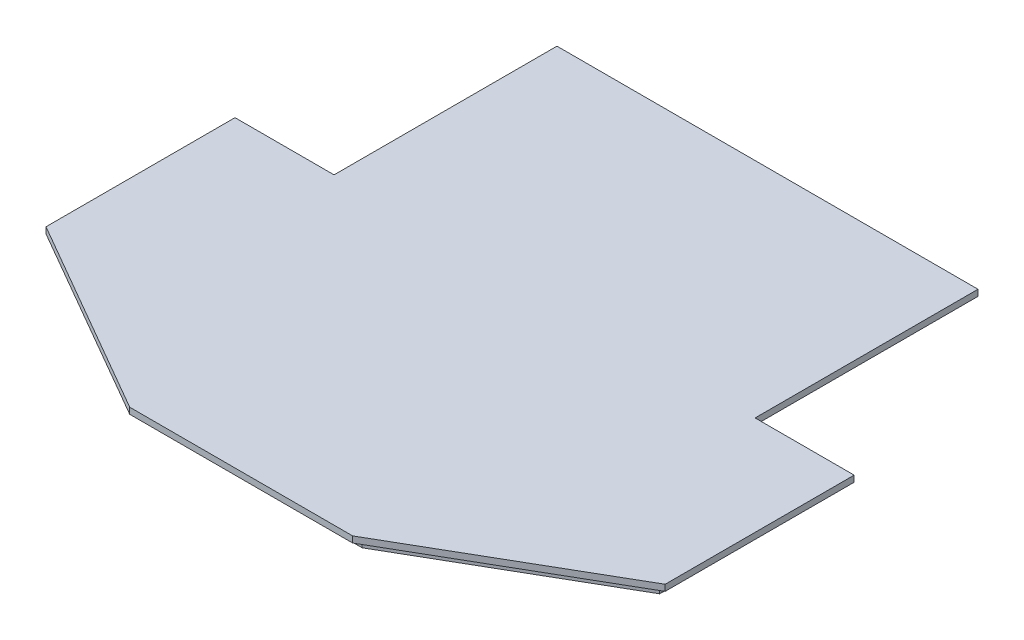
ISO-10303-21;
HEADER;
FILE_DESCRIPTION(('STEP AP214'),'2;1');
FILE_NAME('part.step','',(''),(''),'','','');
FILE_SCHEMA(('AUTOMOTIVE_DESIGN { 1 0 10303 214 1 1 1 1 }'));
ENDSEC;
DATA;
#1=APPLICATION_CONTEXT('core data for automotive mechanical design processes');
#2=APPLICATION_PROTOCOL_DEFINITION('international standard','automotive_design',2000,#1);
#3=PRODUCT_CONTEXT('',#1,'mechanical');
#4=PRODUCT('Part','Part','',(#3));
#5=PRODUCT_RELATED_PRODUCT_CATEGORY('part','',(#4));
#6=PRODUCT_DEFINITION_FORMATION('','',#4);
#7=PRODUCT_DEFINITION_CONTEXT('part definition',#1,'design');
#8=PRODUCT_DEFINITION('design','',#6,#7);
#9=PRODUCT_DEFINITION_SHAPE('','',#8);
#10=(LENGTH_UNIT() NAMED_UNIT(*) SI_UNIT(.MILLI.,.METRE.));
#11=(NAMED_UNIT(*) PLANE_ANGLE_UNIT() SI_UNIT($,.RADIAN.));
#12=(NAMED_UNIT(*) SI_UNIT($,.STERADIAN.) SOLID_ANGLE_UNIT());
#13=UNCERTAINTY_MEASURE_WITH_UNIT(LENGTH_MEASURE(1.E-05),#10,'distance_accuracy_value','');
#14=(GEOMETRIC_REPRESENTATION_CONTEXT(3) GLOBAL_UNCERTAINTY_ASSIGNED_CONTEXT((#13)) GLOBAL_UNIT_ASSIGNED_CONTEXT((#10,
#11,#12)) REPRESENTATION_CONTEXT('',''));
#15=CARTESIAN_POINT('',(0.,0.,0.));
#16=DIRECTION('',(0.,0.,1.));
#17=DIRECTION('',(1.,0.,0.));
#18=AXIS2_PLACEMENT_3D('',#15,#16,#17);
#19=CARTESIAN_POINT('',(-99.9999999999999,2.,72.));
#20=DIRECTION('',(0.,0.,1.));
#21=DIRECTION('',(1.,0.,0.));
#22=AXIS2_PLACEMENT_3D('',#19,#20,#21);
#23=PLANE('',#22);
#24=DIRECTION('',(-1.,0.,0.));
#25=VECTOR('',#24,1.);
#26=CARTESIAN_POINT('',(-99.9999999999999,0.,72.));
#27=LINE('',#26,#25);
#28=CARTESIAN_POINT('',(-68.,0.,72.));
#29=VERTEX_POINT('',#28);
#30=CARTESIAN_POINT('',(-99.9999999999999,0.,72.));
#31=VERTEX_POINT('',#30);
#32=EDGE_CURVE('E375',#29,#31,#27,.T.);
#33=ORIENTED_EDGE('',*,*,#32,.T.);
#34=DIRECTION('',(0.,-1.,0.));
#35=VECTOR('',#34,1.);
#36=CARTESIAN_POINT('',(-99.9999999999999,2.,72.));
#37=LINE('',#36,#35);
#38=CARTESIAN_POINT('',(-99.9999999999999,2.,72.));
#39=VERTEX_POINT('',#38);
#40=EDGE_CURVE('E11',#39,#31,#37,.T.);
#41=ORIENTED_EDGE('',*,*,#40,.F.);
#42=DIRECTION('',(-1.,0.,0.));
#43=VECTOR('',#42,1.);
#44=CARTESIAN_POINT('',(-99.9999999999999,2.,72.));
#45=LINE('',#44,#43);
#46=CARTESIAN_POINT('',(-68.,2.,72.));
#47=VERTEX_POINT('',#46);
#48=EDGE_CURVE('E393',#47,#39,#45,.T.);
#49=ORIENTED_EDGE('',*,*,#48,.F.);
#50=DIRECTION('',(0.,-1.,0.));
#51=VECTOR('',#50,1.);
#52=CARTESIAN_POINT('',(-68.,2.,72.));
#53=LINE('',#52,#51);
#54=EDGE_CURVE('E415',#47,#29,#53,.T.);
#55=ORIENTED_EDGE('',*,*,#54,.T.);
#56=EDGE_LOOP('',(#33,#41,#49,#55));
#57=FACE_BOUND('',#56,.T.);
#58=ADVANCED_FACE('F43',(#57),#23,.F.);
#59=CARTESIAN_POINT('',(-99.9999999999999,2.,72.));
#60=DIRECTION('',(1.,0.,0.));
#61=DIRECTION('',(0.,0.,-1.));
#62=AXIS2_PLACEMENT_3D('',#59,#60,#61);
#63=PLANE('',#62);
#64=DIRECTION('',(0.,0.,1.));
#65=VECTOR('',#64,1.);
#66=CARTESIAN_POINT('',(-99.9999999999999,0.,72.));
#67=LINE('',#66,#65);
#68=CARTESIAN_POINT('',(-99.9999999999999,0.,133.049582771864));
#69=VERTEX_POINT('',#68);
#70=EDGE_CURVE('E418',#31,#69,#67,.T.);
#71=ORIENTED_EDGE('',*,*,#70,.T.);
#72=DIRECTION('',(0.,-1.,0.));
#73=VECTOR('',#72,1.);
#74=CARTESIAN_POINT('',(-99.9999999999999,2.,133.049582771864));
#75=LINE('',#74,#73);
#76=CARTESIAN_POINT('',(-99.9999999999999,2.,133.049582771864));
#77=VERTEX_POINT('',#76);
#78=EDGE_CURVE('E50',#77,#69,#75,.T.);
#79=ORIENTED_EDGE('',*,*,#78,.F.);
#80=DIRECTION('',(0.,0.,1.));
#81=VECTOR('',#80,1.);
#82=CARTESIAN_POINT('',(-99.9999999999999,2.,72.));
#83=LINE('',#82,#81);
#84=EDGE_CURVE('E396',#39,#77,#83,.T.);
#85=ORIENTED_EDGE('',*,*,#84,.F.);
#86=ORIENTED_EDGE('',*,*,#40,.T.);
#87=EDGE_LOOP('',(#71,#79,#85,#86));
#88=FACE_BOUND('',#87,.T.);
#89=ADVANCED_FACE('F485',(#88),#63,.F.);
#90=CARTESIAN_POINT('',(-99.9999999999999,2.,133.049582771864));
#91=DIRECTION('',(0.500000000000001,0.,-0.866025403784438));
#92=DIRECTION('',(-0.866025403784438,0.,-0.500000000000001));
#93=AXIS2_PLACEMENT_3D('',#90,#91,#92);
#94=PLANE('',#93);
#95=DIRECTION('',(0.866025403784438,0.,0.500000000000001));
#96=VECTOR('',#95,1.);
#97=CARTESIAN_POINT('',(-99.9999999999999,0.,133.049582771864));
#98=LINE('',#97,#96);
#99=CARTESIAN_POINT('',(-36.,0.,170.));
#100=VERTEX_POINT('',#99);
#101=EDGE_CURVE('E420',#69,#100,#98,.T.);
#102=ORIENTED_EDGE('',*,*,#101,.T.);
#103=DIRECTION('',(0.,-1.,0.));
#104=VECTOR('',#103,1.);
#105=CARTESIAN_POINT('',(-36.,2.,170.));
#106=LINE('',#105,#104);
#107=CARTESIAN_POINT('',(-36.,2.,170.));
#108=VERTEX_POINT('',#107);
#109=EDGE_CURVE('E455',#108,#100,#106,.T.);
#110=ORIENTED_EDGE('',*,*,#109,.F.);
#111=DIRECTION('',(0.866025403784438,0.,0.500000000000001));
#112=VECTOR('',#111,1.);
#113=CARTESIAN_POINT('',(-99.9999999999999,2.,133.049582771864));
#114=LINE('',#113,#112);
#115=EDGE_CURVE('E399',#77,#108,#114,.T.);
#116=ORIENTED_EDGE('',*,*,#115,.F.);
#117=ORIENTED_EDGE('',*,*,#78,.T.);
#118=EDGE_LOOP('',(#102,#110,#116,#117));
#119=FACE_BOUND('',#118,.T.);
#120=ADVANCED_FACE('F462',(#119),#94,.F.);
#121=CARTESIAN_POINT('',(-36.,2.,170.));
#122=DIRECTION('',(0.,0.,-1.));
#123=DIRECTION('',(-1.,0.,0.));
#124=AXIS2_PLACEMENT_3D('',#121,#122,#123);
#125=PLANE('',#124);
#126=DIRECTION('',(1.,0.,0.));
#127=VECTOR('',#126,1.);
#128=CARTESIAN_POINT('',(-36.,0.,170.));
#129=LINE('',#128,#127);
#130=CARTESIAN_POINT('',(36.,0.,170.));
#131=VERTEX_POINT('',#130);
#132=EDGE_CURVE('E422',#100,#131,#129,.T.);
#133=ORIENTED_EDGE('',*,*,#132,.T.);
#134=DIRECTION('',(0.,-1.,0.));
#135=VECTOR('',#134,1.);
#136=CARTESIAN_POINT('',(36.,2.,170.));
#137=LINE('',#136,#135);
#138=CARTESIAN_POINT('',(36.,2.,170.));
#139=VERTEX_POINT('',#138);
#140=EDGE_CURVE('E452',#139,#131,#137,.T.);
#141=ORIENTED_EDGE('',*,*,#140,.F.);
#142=DIRECTION('',(1.,0.,0.));
#143=VECTOR('',#142,1.);
#144=CARTESIAN_POINT('',(-36.,2.,170.));
#145=LINE('',#144,#143);
#146=EDGE_CURVE('E401',#108,#139,#145,.T.);
#147=ORIENTED_EDGE('',*,*,#146,.F.);
#148=ORIENTED_EDGE('',*,*,#109,.T.);
#149=EDGE_LOOP('',(#133,#141,#147,#148));
#150=FACE_BOUND('',#149,.T.);
#151=ADVANCED_FACE('F473',(#150),#125,.F.);
#152=CARTESIAN_POINT('',(99.9999999999999,2.,133.049582771864));
#153=DIRECTION('',(-0.500000000000001,0.,-0.866025403784438));
#154=DIRECTION('',(-0.866025403784438,0.,0.500000000000001));
#155=AXIS2_PLACEMENT_3D('',#152,#153,#154);
#156=PLANE('',#155);
#157=DIRECTION('',(0.866025403784438,0.,-0.500000000000001));
#158=VECTOR('',#157,1.);
#159=CARTESIAN_POINT('',(99.9999999999999,0.,133.049582771864));
#160=LINE('',#159,#158);
#161=CARTESIAN_POINT('',(99.9999999999999,0.,133.049582771864));
#162=VERTEX_POINT('',#161);
#163=EDGE_CURVE('E424',#131,#162,#160,.T.);
#164=ORIENTED_EDGE('',*,*,#163,.T.);
#165=DIRECTION('',(0.,-1.,0.));
#166=VECTOR('',#165,1.);
#167=CARTESIAN_POINT('',(99.9999999999999,2.,133.049582771864));
#168=LINE('',#167,#166);
#169=CARTESIAN_POINT('',(99.9999999999999,2.,133.049582771864));
#170=VERTEX_POINT('',#169);
#171=EDGE_CURVE('E449',#170,#162,#168,.T.);
#172=ORIENTED_EDGE('',*,*,#171,.F.);
#173=DIRECTION('',(0.866025403784438,0.,-0.500000000000001));
#174=VECTOR('',#173,1.);
#175=CARTESIAN_POINT('',(99.9999999999999,2.,133.049582771864));
#176=LINE('',#175,#174);
#177=EDGE_CURVE('E403',#139,#170,#176,.T.);
#178=ORIENTED_EDGE('',*,*,#177,.F.);
#179=ORIENTED_EDGE('',*,*,#140,.T.);
#180=EDGE_LOOP('',(#164,#172,#178,#179));
#181=FACE_BOUND('',#180,.T.);
#182=ADVANCED_FACE('F477',(#181),#156,.F.);
#183=CARTESIAN_POINT('',(99.9999999999999,2.,72.));
#184=DIRECTION('',(-1.,0.,0.));
#185=DIRECTION('',(0.,0.,1.));
#186=AXIS2_PLACEMENT_3D('',#183,#184,#185);
#187=PLANE('',#186);
#188=DIRECTION('',(0.,0.,-1.));
#189=VECTOR('',#188,1.);
#190=CARTESIAN_POINT('',(99.9999999999999,0.,72.));
#191=LINE('',#190,#189);
#192=CARTESIAN_POINT('',(99.9999999999999,0.,72.));
#193=VERTEX_POINT('',#192);
#194=EDGE_CURVE('E426',#162,#193,#191,.T.);
#195=ORIENTED_EDGE('',*,*,#194,.T.);
#196=DIRECTION('',(0.,-1.,0.));
#197=VECTOR('',#196,1.);
#198=CARTESIAN_POINT('',(99.9999999999999,2.,72.));
#199=LINE('',#198,#197);
#200=CARTESIAN_POINT('',(99.9999999999999,2.,72.));
#201=VERTEX_POINT('',#200);
#202=EDGE_CURVE('E446',#201,#193,#199,.T.);
#203=ORIENTED_EDGE('',*,*,#202,.F.);
#204=DIRECTION('',(0.,0.,-1.));
#205=VECTOR('',#204,1.);
#206=CARTESIAN_POINT('',(99.9999999999999,2.,72.));
#207=LINE('',#206,#205);
#208=EDGE_CURVE('E405',#170,#201,#207,.T.);
#209=ORIENTED_EDGE('',*,*,#208,.F.);
#210=ORIENTED_EDGE('',*,*,#171,.T.);
#211=EDGE_LOOP('',(#195,#203,#209,#210));
#212=FACE_BOUND('',#211,.T.);
#213=ADVANCED_FACE('F508',(#212),#187,.F.);
#214=CARTESIAN_POINT('',(99.9999999999999,2.,72.));
#215=DIRECTION('',(0.,0.,1.));
#216=DIRECTION('',(1.,0.,0.));
#217=AXIS2_PLACEMENT_3D('',#214,#215,#216);
#218=PLANE('',#217);
#219=DIRECTION('',(-1.,0.,0.));
#220=VECTOR('',#219,1.);
#221=CARTESIAN_POINT('',(99.9999999999999,0.,72.));
#222=LINE('',#221,#220);
#223=CARTESIAN_POINT('',(68.,0.,72.));
#224=VERTEX_POINT('',#223);
#225=EDGE_CURVE('E428',#193,#224,#222,.T.);
#226=ORIENTED_EDGE('',*,*,#225,.T.);
#227=DIRECTION('',(0.,-1.,0.));
#228=VECTOR('',#227,1.);
#229=CARTESIAN_POINT('',(68.,2.,72.));
#230=LINE('',#229,#228);
#231=CARTESIAN_POINT('',(68.,2.,72.));
#232=VERTEX_POINT('',#231);
#233=EDGE_CURVE('E443',#232,#224,#230,.T.);
#234=ORIENTED_EDGE('',*,*,#233,.F.);
#235=DIRECTION('',(-1.,0.,0.));
#236=VECTOR('',#235,1.);
#237=CARTESIAN_POINT('',(99.9999999999999,2.,72.));
#238=LINE('',#237,#236);
#239=EDGE_CURVE('E407',#201,#232,#238,.T.);
#240=ORIENTED_EDGE('',*,*,#239,.F.);
#241=ORIENTED_EDGE('',*,*,#202,.T.);
#242=EDGE_LOOP('',(#226,#234,#240,#241));
#243=FACE_BOUND('',#242,.T.);
#244=ADVANCED_FACE('F505',(#243),#218,.F.);
#245=CARTESIAN_POINT('',(68.,2.,72.));
#246=DIRECTION('',(-1.,0.,0.));
#247=DIRECTION('',(0.,0.,1.));
#248=AXIS2_PLACEMENT_3D('',#245,#246,#247);
#249=PLANE('',#248);
#250=DIRECTION('',(0.,0.,-1.));
#251=VECTOR('',#250,1.);
#252=CARTESIAN_POINT('',(68.,0.,72.));
#253=LINE('',#252,#251);
#254=CARTESIAN_POINT('',(68.,0.,0.));
#255=VERTEX_POINT('',#254);
#256=EDGE_CURVE('E430',#224,#255,#253,.T.);
#257=ORIENTED_EDGE('',*,*,#256,.T.);
#258=DIRECTION('',(0.,-1.,0.));
#259=VECTOR('',#258,1.);
#260=CARTESIAN_POINT('',(68.,2.,0.));
#261=LINE('',#260,#259);
#262=CARTESIAN_POINT('',(68.,2.,0.));
#263=VERTEX_POINT('',#262);
#264=EDGE_CURVE('E440',#263,#255,#261,.T.);
#265=ORIENTED_EDGE('',*,*,#264,.F.);
#266=DIRECTION('',(0.,0.,-1.));
#267=VECTOR('',#266,1.);
#268=CARTESIAN_POINT('',(68.,2.,72.));
#269=LINE('',#268,#267);
#270=EDGE_CURVE('E409',#232,#263,#269,.T.);
#271=ORIENTED_EDGE('',*,*,#270,.F.);
#272=ORIENTED_EDGE('',*,*,#233,.T.);
#273=EDGE_LOOP('',(#257,#265,#271,#272));
#274=FACE_BOUND('',#273,.T.);
#275=ADVANCED_FACE('F501',(#274),#249,.F.);
#276=CARTESIAN_POINT('',(-68.,2.,0.));
#277=DIRECTION('',(0.,0.,1.));
#278=DIRECTION('',(1.,0.,0.));
#279=AXIS2_PLACEMENT_3D('',#276,#277,#278);
#280=PLANE('',#279);
#281=DIRECTION('',(-1.,0.,0.));
#282=VECTOR('',#281,1.);
#283=CARTESIAN_POINT('',(-68.,0.,0.));
#284=LINE('',#283,#282);
#285=CARTESIAN_POINT('',(-68.,0.,0.));
#286=VERTEX_POINT('',#285);
#287=EDGE_CURVE('E432',#255,#286,#284,.T.);
#288=ORIENTED_EDGE('',*,*,#287,.T.);
#289=DIRECTION('',(0.,-1.,0.));
#290=VECTOR('',#289,1.);
#291=CARTESIAN_POINT('',(-68.,2.,0.));
#292=LINE('',#291,#290);
#293=CARTESIAN_POINT('',(-68.,2.,0.));
#294=VERTEX_POINT('',#293);
#295=EDGE_CURVE('E437',#294,#286,#292,.T.);
#296=ORIENTED_EDGE('',*,*,#295,.F.);
#297=DIRECTION('',(-1.,0.,0.));
#298=VECTOR('',#297,1.);
#299=CARTESIAN_POINT('',(-68.,2.,0.));
#300=LINE('',#299,#298);
#301=EDGE_CURVE('E411',#263,#294,#300,.T.);
#302=ORIENTED_EDGE('',*,*,#301,.F.);
#303=ORIENTED_EDGE('',*,*,#264,.T.);
#304=EDGE_LOOP('',(#288,#296,#302,#303));
#305=FACE_BOUND('',#304,.T.);
#306=ADVANCED_FACE('F497',(#305),#280,.F.);
#307=CARTESIAN_POINT('',(-68.,2.,72.));
#308=DIRECTION('',(1.,0.,0.));
#309=DIRECTION('',(0.,0.,-1.));
#310=AXIS2_PLACEMENT_3D('',#307,#308,#309);
#311=PLANE('',#310);
#312=DIRECTION('',(0.,0.,1.));
#313=VECTOR('',#312,1.);
#314=CARTESIAN_POINT('',(-68.,0.,72.));
#315=LINE('',#314,#313);
#316=EDGE_CURVE('E397',#286,#29,#315,.T.);
#317=ORIENTED_EDGE('',*,*,#316,.T.);
#318=ORIENTED_EDGE('',*,*,#54,.F.);
#319=DIRECTION('',(0.,0.,1.));
#320=VECTOR('',#319,1.);
#321=CARTESIAN_POINT('',(-68.,2.,72.));
#322=LINE('',#321,#320);
#323=EDGE_CURVE('E413',#294,#47,#322,.T.);
#324=ORIENTED_EDGE('',*,*,#323,.F.);
#325=ORIENTED_EDGE('',*,*,#295,.T.);
#326=EDGE_LOOP('',(#317,#318,#324,#325));
#327=FACE_BOUND('',#326,.T.);
#328=ADVANCED_FACE('F492',(#327),#311,.F.);
#329=CARTESIAN_POINT('',(0.,2.,0.));
#330=DIRECTION('',(0.,1.,0.));
#331=DIRECTION('',(0.,0.,1.));
#332=AXIS2_PLACEMENT_3D('',#329,#330,#331);
#333=PLANE('',#332);
#334=ORIENTED_EDGE('',*,*,#48,.T.);
#335=ORIENTED_EDGE('',*,*,#84,.T.);
#336=ORIENTED_EDGE('',*,*,#115,.T.);
#337=ORIENTED_EDGE('',*,*,#146,.T.);
#338=ORIENTED_EDGE('',*,*,#177,.T.);
#339=ORIENTED_EDGE('',*,*,#208,.T.);
#340=ORIENTED_EDGE('',*,*,#239,.T.);
#341=ORIENTED_EDGE('',*,*,#270,.T.);
#342=ORIENTED_EDGE('',*,*,#301,.T.);
#343=ORIENTED_EDGE('',*,*,#323,.T.);
#344=EDGE_LOOP('',(#334,#335,#336,#337,#338,#339,#340,#341,#342,#343));
#345=FACE_BOUND('',#344,.T.);
#346=ADVANCED_FACE('F481',(#345),#333,.T.);
#347=CARTESIAN_POINT('',(0.,0.,0.));
#348=DIRECTION('',(0.,1.,0.));
#349=DIRECTION('',(0.,0.,1.));
#350=AXIS2_PLACEMENT_3D('',#347,#348,#349);
#351=PLANE('',#350);
#352=DIRECTION('',(0.866025403784439,0.,-0.5));
#353=VECTOR('',#352,1.);
#354=CARTESIAN_POINT('',(34.874613391789,0.,165.800000000001));
#355=LINE('',#354,#353);
#356=CARTESIAN_POINT('',(34.874613391789,0.,165.800000000001));
#357=VERTEX_POINT('',#356);
#358=CARTESIAN_POINT('',(95.8000000000003,0.,130.624711641268));
#359=VERTEX_POINT('',#358);
#360=EDGE_CURVE('E318',#357,#359,#355,.T.);
#361=ORIENTED_EDGE('',*,*,#360,.T.);
#362=DIRECTION('',(0.,0.,-1.));
#363=VECTOR('',#362,1.);
#364=CARTESIAN_POINT('',(95.8000000000003,0.,130.624711641268));
#365=LINE('',#364,#363);
#366=CARTESIAN_POINT('',(95.8000000000003,0.,76.1999999999997));
#367=VERTEX_POINT('',#366);
#368=EDGE_CURVE('E65',#359,#367,#365,.T.);
#369=ORIENTED_EDGE('',*,*,#368,.T.);
#370=DIRECTION('',(-1.,0.,0.));
#371=VECTOR('',#370,1.);
#372=CARTESIAN_POINT('',(95.8000000000003,0.,76.1999999999997));
#373=LINE('',#372,#371);
#374=CARTESIAN_POINT('',(63.8,0.,76.1999999999997));
#375=VERTEX_POINT('',#374);
#376=EDGE_CURVE('E347',#367,#375,#373,.T.);
#377=ORIENTED_EDGE('',*,*,#376,.T.);
#378=DIRECTION('',(0.,0.,-1.));
#379=VECTOR('',#378,1.);
#380=CARTESIAN_POINT('',(63.8,0.,76.1999999999997));
#381=LINE('',#380,#379);
#382=CARTESIAN_POINT('',(63.8,0.,4.2));
#383=VERTEX_POINT('',#382);
#384=EDGE_CURVE('E350',#375,#383,#381,.T.);
#385=ORIENTED_EDGE('',*,*,#384,.T.);
#386=DIRECTION('',(-1.,0.,0.));
#387=VECTOR('',#386,1.);
#388=CARTESIAN_POINT('',(63.8,0.,4.2));
#389=LINE('',#388,#387);
#390=CARTESIAN_POINT('',(-63.8000000000006,0.,4.2));
#391=VERTEX_POINT('',#390);
#392=EDGE_CURVE('E353',#383,#391,#389,.T.);
#393=ORIENTED_EDGE('',*,*,#392,.T.);
#394=DIRECTION('',(0.,0.,1.));
#395=VECTOR('',#394,1.);
#396=CARTESIAN_POINT('',(-63.8000000000006,0.,4.2));
#397=LINE('',#396,#395);
#398=CARTESIAN_POINT('',(-63.8000000000006,0.,76.2000000000009));
#399=VERTEX_POINT('',#398);
#400=EDGE_CURVE('E356',#391,#399,#397,.T.);
#401=ORIENTED_EDGE('',*,*,#400,.T.);
#402=DIRECTION('',(-1.,0.,0.));
#403=VECTOR('',#402,1.);
#404=CARTESIAN_POINT('',(-63.8000000000006,0.,76.2000000000009));
#405=LINE('',#404,#403);
#406=CARTESIAN_POINT('',(-95.8000000000001,0.,76.2000000000009));
#407=VERTEX_POINT('',#406);
#408=EDGE_CURVE('E359',#399,#407,#405,.T.);
#409=ORIENTED_EDGE('',*,*,#408,.T.);
#410=DIRECTION('',(0.,0.,1.));
#411=VECTOR('',#410,1.);
#412=CARTESIAN_POINT('',(-95.8000000000001,0.,76.2000000000009));
#413=LINE('',#412,#411);
#414=CARTESIAN_POINT('',(-95.8000000000001,0.,130.624711641268));
#415=VERTEX_POINT('',#414);
#416=EDGE_CURVE('E362',#407,#415,#413,.T.);
#417=ORIENTED_EDGE('',*,*,#416,.T.);
#418=DIRECTION('',(0.866025403784439,0.,0.5));
#419=VECTOR('',#418,1.);
#420=CARTESIAN_POINT('',(-95.8000000000001,0.,130.624711641268));
#421=LINE('',#420,#419);
#422=CARTESIAN_POINT('',(-34.8746133917895,0.,165.800000000001));
#423=VERTEX_POINT('',#422);
#424=EDGE_CURVE('E365',#415,#423,#421,.T.);
#425=ORIENTED_EDGE('',*,*,#424,.T.);
#426=DIRECTION('',(1.,0.,0.));
#427=VECTOR('',#426,1.);
#428=CARTESIAN_POINT('',(-34.8746133917895,0.,165.800000000001));
#429=LINE('',#428,#427);
#430=EDGE_CURVE('E368',#423,#357,#429,.T.);
#431=ORIENTED_EDGE('',*,*,#430,.T.);
#432=EDGE_LOOP('',(#361,#369,#377,#385,#393,#401,#409,#417,#425,#431));
#433=FACE_BOUND('',#432,.T.);
#434=ORIENTED_EDGE('',*,*,#32,.F.);
#435=ORIENTED_EDGE('',*,*,#316,.F.);
#436=ORIENTED_EDGE('',*,*,#287,.F.);
#437=ORIENTED_EDGE('',*,*,#256,.F.);
#438=ORIENTED_EDGE('',*,*,#225,.F.);
#439=ORIENTED_EDGE('',*,*,#194,.F.);
#440=ORIENTED_EDGE('',*,*,#163,.F.);
#441=ORIENTED_EDGE('',*,*,#132,.F.);
#442=ORIENTED_EDGE('',*,*,#101,.F.);
#443=ORIENTED_EDGE('',*,*,#70,.F.);
#444=EDGE_LOOP('',(#434,#435,#436,#437,#438,#439,#440,#441,#442,#443));
#445=FACE_BOUND('',#444,.T.);
#446=ADVANCED_FACE('F468',(#433,#445),#351,.F.);
#447=CARTESIAN_POINT('',(95.8000000000003,-4.,130.624711641268));
#448=DIRECTION('',(1.,0.,0.));
#449=DIRECTION('',(0.,0.,-1.));
#450=AXIS2_PLACEMENT_3D('',#447,#448,#449);
#451=PLANE('',#450);
#452=ORIENTED_EDGE('',*,*,#368,.F.);
#453=DIRECTION('',(0.,1.,0.));
#454=VECTOR('',#453,1.);
#455=CARTESIAN_POINT('',(95.8000000000003,-4.,130.624711641268));
#456=LINE('',#455,#454);
#457=CARTESIAN_POINT('',(95.8000000000003,-4.,130.624711641268));
#458=VERTEX_POINT('',#457);
#459=EDGE_CURVE('E373',#458,#359,#456,.T.);
#460=ORIENTED_EDGE('',*,*,#459,.F.);
#461=DIRECTION('',(0.,0.,-1.));
#462=VECTOR('',#461,1.);
#463=CARTESIAN_POINT('',(95.8000000000003,-4.,130.624711641268));
#464=LINE('',#463,#462);
#465=CARTESIAN_POINT('',(95.8000000000003,-4.,76.1999999999997));
#466=VERTEX_POINT('',#465);
#467=EDGE_CURVE('E314',#458,#466,#464,.T.);
#468=ORIENTED_EDGE('',*,*,#467,.T.);
#469=DIRECTION('',(0.,1.,0.));
#470=VECTOR('',#469,1.);
#471=CARTESIAN_POINT('',(95.8000000000003,-4.,76.1999999999997));
#472=LINE('',#471,#470);
#473=EDGE_CURVE('E345',#466,#367,#472,.T.);
#474=ORIENTED_EDGE('',*,*,#473,.T.);
#475=EDGE_LOOP('',(#452,#460,#468,#474));
#476=FACE_BOUND('',#475,.T.);
#477=ADVANCED_FACE('F588',(#476),#451,.T.);
#478=CARTESIAN_POINT('',(34.874613391789,-4.,165.800000000001));
#479=DIRECTION('',(0.5,0.,0.866025403784439));
#480=DIRECTION('',(0.866025403784439,0.,-0.5));
#481=AXIS2_PLACEMENT_3D('',#478,#479,#480);
#482=PLANE('',#481);
#483=ORIENTED_EDGE('',*,*,#360,.F.);
#484=DIRECTION('',(0.,1.,0.));
#485=VECTOR('',#484,1.);
#486=CARTESIAN_POINT('',(34.874613391789,-4.,165.800000000001));
#487=LINE('',#486,#485);
#488=CARTESIAN_POINT('',(34.874613391789,-4.,165.800000000001));
#489=VERTEX_POINT('',#488);
#490=EDGE_CURVE('E376',#489,#357,#487,.T.);
#491=ORIENTED_EDGE('',*,*,#490,.F.);
#492=DIRECTION('',(0.866025403784439,0.,-0.5));
#493=VECTOR('',#492,1.);
#494=CARTESIAN_POINT('',(34.874613391789,-4.,165.800000000001));
#495=LINE('',#494,#493);
#496=EDGE_CURVE('E342',#489,#458,#495,.T.);
#497=ORIENTED_EDGE('',*,*,#496,.T.);
#498=ORIENTED_EDGE('',*,*,#459,.T.);
#499=EDGE_LOOP('',(#483,#491,#497,#498));
#500=FACE_BOUND('',#499,.T.);
#501=ADVANCED_FACE('F598',(#500),#482,.T.);
#502=CARTESIAN_POINT('',(-34.8746133917895,-4.,165.800000000001));
#503=DIRECTION('',(0.,0.,1.));
#504=DIRECTION('',(1.,0.,0.));
#505=AXIS2_PLACEMENT_3D('',#502,#503,#504);
#506=PLANE('',#505);
#507=ORIENTED_EDGE('',*,*,#430,.F.);
#508=DIRECTION('',(0.,1.,0.));
#509=VECTOR('',#508,1.);
#510=CARTESIAN_POINT('',(-34.8746133917895,-4.,165.800000000001));
#511=LINE('',#510,#509);
#512=CARTESIAN_POINT('',(-34.8746133917895,-4.,165.800000000001));
#513=VERTEX_POINT('',#512);
#514=EDGE_CURVE('E378',#513,#423,#511,.T.);
#515=ORIENTED_EDGE('',*,*,#514,.F.);
#516=DIRECTION('',(1.,0.,0.));
#517=VECTOR('',#516,1.);
#518=CARTESIAN_POINT('',(-34.8746133917895,-4.,165.800000000001));
#519=LINE('',#518,#517);
#520=EDGE_CURVE('E339',#513,#489,#519,.T.);
#521=ORIENTED_EDGE('',*,*,#520,.T.);
#522=ORIENTED_EDGE('',*,*,#490,.T.);
#523=EDGE_LOOP('',(#507,#515,#521,#522));
#524=FACE_BOUND('',#523,.T.);
#525=ADVANCED_FACE('F607',(#524),#506,.T.);
#526=CARTESIAN_POINT('',(-95.8000000000001,-4.,130.624711641268));
#527=DIRECTION('',(-0.5,0.,0.866025403784439));
#528=DIRECTION('',(0.866025403784439,0.,0.5));
#529=AXIS2_PLACEMENT_3D('',#526,#527,#528);
#530=PLANE('',#529);
#531=ORIENTED_EDGE('',*,*,#424,.F.);
#532=DIRECTION('',(0.,1.,0.));
#533=VECTOR('',#532,1.);
#534=CARTESIAN_POINT('',(-95.8000000000001,-4.,130.624711641268));
#535=LINE('',#534,#533);
#536=CARTESIAN_POINT('',(-95.8000000000001,-4.,130.624711641268));
#537=VERTEX_POINT('',#536);
#538=EDGE_CURVE('E380',#537,#415,#535,.T.);
#539=ORIENTED_EDGE('',*,*,#538,.F.);
#540=DIRECTION('',(0.866025403784439,0.,0.5));
#541=VECTOR('',#540,1.);
#542=CARTESIAN_POINT('',(-95.8000000000001,-4.,130.624711641268));
#543=LINE('',#542,#541);
#544=EDGE_CURVE('E336',#537,#513,#543,.T.);
#545=ORIENTED_EDGE('',*,*,#544,.T.);
#546=ORIENTED_EDGE('',*,*,#514,.T.);
#547=EDGE_LOOP('',(#531,#539,#545,#546));
#548=FACE_BOUND('',#547,.T.);
#549=ADVANCED_FACE('F617',(#548),#530,.T.);
#550=CARTESIAN_POINT('',(-95.8000000000001,-4.,76.2000000000009));
#551=DIRECTION('',(-1.,0.,0.));
#552=DIRECTION('',(0.,0.,1.));
#553=AXIS2_PLACEMENT_3D('',#550,#551,#552);
#554=PLANE('',#553);
#555=ORIENTED_EDGE('',*,*,#416,.F.);
#556=DIRECTION('',(0.,1.,0.));
#557=VECTOR('',#556,1.);
#558=CARTESIAN_POINT('',(-95.8000000000001,-4.,76.2000000000009));
#559=LINE('',#558,#557);
#560=CARTESIAN_POINT('',(-95.8000000000001,-4.,76.2000000000009));
#561=VERTEX_POINT('',#560);
#562=EDGE_CURVE('E382',#561,#407,#559,.T.);
#563=ORIENTED_EDGE('',*,*,#562,.F.);
#564=DIRECTION('',(0.,0.,1.));
#565=VECTOR('',#564,1.);
#566=CARTESIAN_POINT('',(-95.8000000000001,-4.,76.2000000000009));
#567=LINE('',#566,#565);
#568=EDGE_CURVE('E333',#561,#537,#567,.T.);
#569=ORIENTED_EDGE('',*,*,#568,.T.);
#570=ORIENTED_EDGE('',*,*,#538,.T.);
#571=EDGE_LOOP('',(#555,#563,#569,#570));
#572=FACE_BOUND('',#571,.T.);
#573=ADVANCED_FACE('F627',(#572),#554,.T.);
#574=CARTESIAN_POINT('',(-63.8000000000006,-4.,76.2000000000009));
#575=DIRECTION('',(0.,0.,-1.));
#576=DIRECTION('',(-1.,0.,0.));
#577=AXIS2_PLACEMENT_3D('',#574,#575,#576);
#578=PLANE('',#577);
#579=ORIENTED_EDGE('',*,*,#408,.F.);
#580=DIRECTION('',(0.,1.,0.));
#581=VECTOR('',#580,1.);
#582=CARTESIAN_POINT('',(-63.8000000000006,-4.,76.2000000000009));
#583=LINE('',#582,#581);
#584=CARTESIAN_POINT('',(-63.8000000000006,-4.,76.2000000000009));
#585=VERTEX_POINT('',#584);
#586=EDGE_CURVE('E384',#585,#399,#583,.T.);
#587=ORIENTED_EDGE('',*,*,#586,.F.);
#588=DIRECTION('',(-1.,0.,0.));
#589=VECTOR('',#588,1.);
#590=CARTESIAN_POINT('',(-63.8000000000006,-4.,76.2000000000009));
#591=LINE('',#590,#589);
#592=EDGE_CURVE('E330',#585,#561,#591,.T.);
#593=ORIENTED_EDGE('',*,*,#592,.T.);
#594=ORIENTED_EDGE('',*,*,#562,.T.);
#595=EDGE_LOOP('',(#579,#587,#593,#594));
#596=FACE_BOUND('',#595,.T.);
#597=ADVANCED_FACE('F637',(#596),#578,.T.);
#598=CARTESIAN_POINT('',(-63.8000000000006,-4.,4.2));
#599=DIRECTION('',(-1.,0.,0.));
#600=DIRECTION('',(0.,0.,1.));
#601=AXIS2_PLACEMENT_3D('',#598,#599,#600);
#602=PLANE('',#601);
#603=ORIENTED_EDGE('',*,*,#400,.F.);
#604=DIRECTION('',(0.,1.,0.));
#605=VECTOR('',#604,1.);
#606=CARTESIAN_POINT('',(-63.8000000000006,-4.,4.2));
#607=LINE('',#606,#605);
#608=CARTESIAN_POINT('',(-63.8000000000006,-4.,4.2));
#609=VERTEX_POINT('',#608);
#610=EDGE_CURVE('E386',#609,#391,#607,.T.);
#611=ORIENTED_EDGE('',*,*,#610,.F.);
#612=DIRECTION('',(0.,0.,1.));
#613=VECTOR('',#612,1.);
#614=CARTESIAN_POINT('',(-63.8000000000006,-4.,4.2));
#615=LINE('',#614,#613);
#616=EDGE_CURVE('E327',#609,#585,#615,.T.);
#617=ORIENTED_EDGE('',*,*,#616,.T.);
#618=ORIENTED_EDGE('',*,*,#586,.T.);
#619=EDGE_LOOP('',(#603,#611,#617,#618));
#620=FACE_BOUND('',#619,.T.);
#621=ADVANCED_FACE('F647',(#620),#602,.T.);
#622=CARTESIAN_POINT('',(63.8,-4.,4.2));
#623=DIRECTION('',(0.,0.,-1.));
#624=DIRECTION('',(-1.,0.,0.));
#625=AXIS2_PLACEMENT_3D('',#622,#623,#624);
#626=PLANE('',#625);
#627=ORIENTED_EDGE('',*,*,#392,.F.);
#628=DIRECTION('',(0.,1.,0.));
#629=VECTOR('',#628,1.);
#630=CARTESIAN_POINT('',(63.8,-4.,4.2));
#631=LINE('',#630,#629);
#632=CARTESIAN_POINT('',(63.8,-4.,4.2));
#633=VERTEX_POINT('',#632);
#634=EDGE_CURVE('E388',#633,#383,#631,.T.);
#635=ORIENTED_EDGE('',*,*,#634,.F.);
#636=DIRECTION('',(-1.,0.,0.));
#637=VECTOR('',#636,1.);
#638=CARTESIAN_POINT('',(63.8,-4.,4.2));
#639=LINE('',#638,#637);
#640=EDGE_CURVE('E324',#633,#609,#639,.T.);
#641=ORIENTED_EDGE('',*,*,#640,.T.);
#642=ORIENTED_EDGE('',*,*,#610,.T.);
#643=EDGE_LOOP('',(#627,#635,#641,#642));
#644=FACE_BOUND('',#643,.T.);
#645=ADVANCED_FACE('F658',(#644),#626,.T.);
#646=CARTESIAN_POINT('',(63.8,-4.,76.1999999999997));
#647=DIRECTION('',(1.,0.,0.));
#648=DIRECTION('',(0.,0.,-1.));
#649=AXIS2_PLACEMENT_3D('',#646,#647,#648);
#650=PLANE('',#649);
#651=ORIENTED_EDGE('',*,*,#384,.F.);
#652=DIRECTION('',(0.,1.,0.));
#653=VECTOR('',#652,1.);
#654=CARTESIAN_POINT('',(63.8,-4.,76.1999999999997));
#655=LINE('',#654,#653);
#656=CARTESIAN_POINT('',(63.8,-4.,76.1999999999997));
#657=VERTEX_POINT('',#656);
#658=EDGE_CURVE('E390',#657,#375,#655,.T.);
#659=ORIENTED_EDGE('',*,*,#658,.F.);
#660=DIRECTION('',(0.,0.,-1.));
#661=VECTOR('',#660,1.);
#662=CARTESIAN_POINT('',(63.8,-4.,76.1999999999997));
#663=LINE('',#662,#661);
#664=EDGE_CURVE('E321',#657,#633,#663,.T.);
#665=ORIENTED_EDGE('',*,*,#664,.T.);
#666=ORIENTED_EDGE('',*,*,#634,.T.);
#667=EDGE_LOOP('',(#651,#659,#665,#666));
#668=FACE_BOUND('',#667,.T.);
#669=ADVANCED_FACE('F668',(#668),#650,.T.);
#670=CARTESIAN_POINT('',(95.8000000000003,-4.,76.1999999999997));
#671=DIRECTION('',(0.,0.,-1.));
#672=DIRECTION('',(-1.,0.,0.));
#673=AXIS2_PLACEMENT_3D('',#670,#671,#672);
#674=PLANE('',#673);
#675=ORIENTED_EDGE('',*,*,#376,.F.);
#676=ORIENTED_EDGE('',*,*,#473,.F.);
#677=DIRECTION('',(-1.,0.,0.));
#678=VECTOR('',#677,1.);
#679=CARTESIAN_POINT('',(95.8000000000003,-4.,76.1999999999997));
#680=LINE('',#679,#678);
#681=EDGE_CURVE('E317',#466,#657,#680,.T.);
#682=ORIENTED_EDGE('',*,*,#681,.T.);
#683=ORIENTED_EDGE('',*,*,#658,.T.);
#684=EDGE_LOOP('',(#675,#676,#682,#683));
#685=FACE_BOUND('',#684,.T.);
#686=ADVANCED_FACE('F678',(#685),#674,.T.);
#687=CARTESIAN_POINT('',(0.,-4.,0.));
#688=DIRECTION('',(0.,1.,0.));
#689=DIRECTION('',(0.,0.,1.));
#690=AXIS2_PLACEMENT_3D('',#687,#688,#689);
#691=PLANE('',#690);
#692=DIRECTION('',(0.866025403784439,0.,-0.5));
#693=VECTOR('',#692,1.);
#694=CARTESIAN_POINT('',(78.5121593216775,-4.,135.987048957088));
#695=LINE('',#694,#693);
#696=CARTESIAN_POINT('',(33.8028166220646,-4.,161.800000000001));
#697=VERTEX_POINT('',#696);
#698=CARTESIAN_POINT('',(91.8000000000003,-4.,128.315310564509));
#699=VERTEX_POINT('',#698);
#700=EDGE_CURVE('E246',#697,#699,#695,.T.);
#701=ORIENTED_EDGE('',*,*,#700,.T.);
#702=DIRECTION('',(0.,0.,-1.));
#703=VECTOR('',#702,1.);
#704=CARTESIAN_POINT('',(91.8000000000003,-4.,0.));
#705=LINE('',#704,#703);
#706=CARTESIAN_POINT('',(91.8000000000003,-4.,80.1999999999998));
#707=VERTEX_POINT('',#706);
#708=EDGE_CURVE('E254',#699,#707,#705,.T.);
#709=ORIENTED_EDGE('',*,*,#708,.T.);
#710=DIRECTION('',(-1.,0.,0.));
#711=VECTOR('',#710,1.);
#712=CARTESIAN_POINT('',(0.,-4.,80.1999999999998));
#713=LINE('',#712,#711);
#714=CARTESIAN_POINT('',(59.8,-4.,80.1999999999998));
#715=VERTEX_POINT('',#714);
#716=EDGE_CURVE('E261',#707,#715,#713,.T.);
#717=ORIENTED_EDGE('',*,*,#716,.T.);
#718=DIRECTION('',(0.,0.,-1.));
#719=VECTOR('',#718,1.);
#720=CARTESIAN_POINT('',(59.8,-4.,0.));
#721=LINE('',#720,#719);
#722=CARTESIAN_POINT('',(59.8,-4.,8.2));
#723=VERTEX_POINT('',#722);
#724=EDGE_CURVE('E57',#715,#723,#721,.T.);
#725=ORIENTED_EDGE('',*,*,#724,.T.);
#726=DIRECTION('',(-1.,0.,0.));
#727=VECTOR('',#726,1.);
#728=CARTESIAN_POINT('',(0.,-4.,8.2));
#729=LINE('',#728,#727);
#730=CARTESIAN_POINT('',(-59.8000000000006,-4.,8.2));
#731=VERTEX_POINT('',#730);
#732=EDGE_CURVE('E285',#723,#731,#729,.T.);
#733=ORIENTED_EDGE('',*,*,#732,.T.);
#734=DIRECTION('',(0.,0.,1.));
#735=VECTOR('',#734,1.);
#736=CARTESIAN_POINT('',(-59.8000000000006,-4.,0.));
#737=LINE('',#736,#735);
#738=CARTESIAN_POINT('',(-59.8000000000006,-4.,80.2000000000009));
#739=VERTEX_POINT('',#738);
#740=EDGE_CURVE('E282',#731,#739,#737,.T.);
#741=ORIENTED_EDGE('',*,*,#740,.T.);
#742=DIRECTION('',(-1.,0.,0.));
#743=VECTOR('',#742,1.);
#744=CARTESIAN_POINT('',(0.,-4.,80.2000000000009));
#745=LINE('',#744,#743);
#746=CARTESIAN_POINT('',(-91.8000000000001,-4.,80.2000000000009));
#747=VERTEX_POINT('',#746);
#748=EDGE_CURVE('E279',#739,#747,#745,.T.);
#749=ORIENTED_EDGE('',*,*,#748,.T.);
#750=DIRECTION('',(0.,0.,1.));
#751=VECTOR('',#750,1.);
#752=CARTESIAN_POINT('',(-91.8000000000001,-4.,0.));
#753=LINE('',#752,#751);
#754=CARTESIAN_POINT('',(-91.8000000000001,-4.,128.31531056451));
#755=VERTEX_POINT('',#754);
#756=EDGE_CURVE('E276',#747,#755,#753,.T.);
#757=ORIENTED_EDGE('',*,*,#756,.T.);
#758=DIRECTION('',(0.866025403784439,0.,0.5));
#759=VECTOR('',#758,1.);
#760=CARTESIAN_POINT('',(-78.5121593216776,-4.,135.987048957088));
#761=LINE('',#760,#759);
#762=CARTESIAN_POINT('',(-33.802816622065,-4.,161.800000000001));
#763=VERTEX_POINT('',#762);
#764=EDGE_CURVE('E271',#755,#763,#761,.T.);
#765=ORIENTED_EDGE('',*,*,#764,.T.);
#766=DIRECTION('',(1.,0.,0.));
#767=VECTOR('',#766,1.);
#768=CARTESIAN_POINT('',(0.,-4.,161.800000000001));
#769=LINE('',#768,#767);
#770=EDGE_CURVE('E267',#763,#697,#769,.T.);
#771=ORIENTED_EDGE('',*,*,#770,.T.);
#772=EDGE_LOOP('',(#701,#709,#717,#725,#733,#741,#749,#757,#765,#771));
#773=FACE_BOUND('',#772,.T.);
#774=ORIENTED_EDGE('',*,*,#467,.F.);
#775=ORIENTED_EDGE('',*,*,#496,.F.);
#776=ORIENTED_EDGE('',*,*,#520,.F.);
#777=ORIENTED_EDGE('',*,*,#544,.F.);
#778=ORIENTED_EDGE('',*,*,#568,.F.);
#779=ORIENTED_EDGE('',*,*,#592,.F.);
#780=ORIENTED_EDGE('',*,*,#616,.F.);
#781=ORIENTED_EDGE('',*,*,#640,.F.);
#782=ORIENTED_EDGE('',*,*,#664,.F.);
#783=ORIENTED_EDGE('',*,*,#681,.F.);
#784=EDGE_LOOP('',(#774,#775,#776,#777,#778,#779,#780,#781,#782,#783));
#785=FACE_BOUND('',#784,.T.);
#786=ADVANCED_FACE('F263',(#773,#785),#691,.F.);
#787=CARTESIAN_POINT('',(0.,-2.,0.));
#788=DIRECTION('',(0.,1.,0.));
#789=DIRECTION('',(0.,0.,1.));
#790=AXIS2_PLACEMENT_3D('',#787,#788,#789);
#791=PLANE('',#790);
#792=DIRECTION('',(0.866025403784439,0.,0.5));
#793=VECTOR('',#792,1.);
#794=CARTESIAN_POINT('',(-78.5121593216776,-2.,135.987048957088));
#795=LINE('',#794,#793);
#796=CARTESIAN_POINT('',(-91.8000000000001,-2.,128.31531056451));
#797=VERTEX_POINT('',#796);
#798=CARTESIAN_POINT('',(-33.802816622065,-2.,161.800000000001));
#799=VERTEX_POINT('',#798);
#800=EDGE_CURVE('E309',#797,#799,#795,.T.);
#801=ORIENTED_EDGE('',*,*,#800,.F.);
#802=DIRECTION('',(0.,0.,1.));
#803=VECTOR('',#802,1.);
#804=CARTESIAN_POINT('',(-91.8000000000001,-2.,0.));
#805=LINE('',#804,#803);
#806=CARTESIAN_POINT('',(-91.8000000000001,-2.,80.2000000000009));
#807=VERTEX_POINT('',#806);
#808=EDGE_CURVE('E307',#807,#797,#805,.T.);
#809=ORIENTED_EDGE('',*,*,#808,.F.);
#810=DIRECTION('',(-1.,0.,0.));
#811=VECTOR('',#810,1.);
#812=CARTESIAN_POINT('',(0.,-2.,80.2000000000009));
#813=LINE('',#812,#811);
#814=CARTESIAN_POINT('',(-59.8000000000006,-2.,80.2000000000009));
#815=VERTEX_POINT('',#814);
#816=EDGE_CURVE('E305',#815,#807,#813,.T.);
#817=ORIENTED_EDGE('',*,*,#816,.F.);
#818=DIRECTION('',(0.,0.,1.));
#819=VECTOR('',#818,1.);
#820=CARTESIAN_POINT('',(-59.8000000000006,-2.,0.));
#821=LINE('',#820,#819);
#822=CARTESIAN_POINT('',(-59.8000000000006,-2.,8.2));
#823=VERTEX_POINT('',#822);
#824=EDGE_CURVE('E302',#823,#815,#821,.T.);
#825=ORIENTED_EDGE('',*,*,#824,.F.);
#826=DIRECTION('',(-1.,0.,0.));
#827=VECTOR('',#826,1.);
#828=CARTESIAN_POINT('',(0.,-2.,8.2));
#829=LINE('',#828,#827);
#830=CARTESIAN_POINT('',(59.8,-2.,8.2));
#831=VERTEX_POINT('',#830);
#832=EDGE_CURVE('E299',#831,#823,#829,.T.);
#833=ORIENTED_EDGE('',*,*,#832,.F.);
#834=DIRECTION('',(0.,0.,-1.));
#835=VECTOR('',#834,1.);
#836=CARTESIAN_POINT('',(59.8,-2.,0.));
#837=LINE('',#836,#835);
#838=CARTESIAN_POINT('',(59.8,-2.,80.1999999999998));
#839=VERTEX_POINT('',#838);
#840=EDGE_CURVE('E296',#839,#831,#837,.T.);
#841=ORIENTED_EDGE('',*,*,#840,.F.);
#842=DIRECTION('',(-1.,0.,0.));
#843=VECTOR('',#842,1.);
#844=CARTESIAN_POINT('',(0.,-2.,80.1999999999998));
#845=LINE('',#844,#843);
#846=CARTESIAN_POINT('',(91.8000000000003,-2.,80.1999999999998));
#847=VERTEX_POINT('',#846);
#848=EDGE_CURVE('E293',#847,#839,#845,.T.);
#849=ORIENTED_EDGE('',*,*,#848,.F.);
#850=DIRECTION('',(0.,0.,-1.));
#851=VECTOR('',#850,1.);
#852=CARTESIAN_POINT('',(91.8000000000003,-2.,0.));
#853=LINE('',#852,#851);
#854=CARTESIAN_POINT('',(91.8000000000003,-2.,128.315310564509));
#855=VERTEX_POINT('',#854);
#856=EDGE_CURVE('E291',#855,#847,#853,.T.);
#857=ORIENTED_EDGE('',*,*,#856,.F.);
#858=DIRECTION('',(0.866025403784439,0.,-0.5));
#859=VECTOR('',#858,1.);
#860=CARTESIAN_POINT('',(78.5121593216775,-2.,135.987048957088));
#861=LINE('',#860,#859);
#862=CARTESIAN_POINT('',(33.8028166220646,-2.,161.800000000001));
#863=VERTEX_POINT('',#862);
#864=EDGE_CURVE('E248',#863,#855,#861,.T.);
#865=ORIENTED_EDGE('',*,*,#864,.F.);
#866=DIRECTION('',(1.,0.,0.));
#867=VECTOR('',#866,1.);
#868=CARTESIAN_POINT('',(0.,-2.,161.800000000001));
#869=LINE('',#868,#867);
#870=EDGE_CURVE('E311',#799,#863,#869,.T.);
#871=ORIENTED_EDGE('',*,*,#870,.F.);
#872=EDGE_LOOP('',(#801,#809,#817,#825,#833,#841,#849,#857,#865,#871));
#873=FACE_BOUND('',#872,.T.);
#874=ADVANCED_FACE('F697',(#873),#791,.F.);
#875=CARTESIAN_POINT('',(91.8000000000003,-4.,130.624711641268));
#876=DIRECTION('',(1.,0.,0.));
#877=DIRECTION('',(0.,0.,-1.));
#878=AXIS2_PLACEMENT_3D('',#875,#876,#877);
#879=PLANE('',#878);
#880=ORIENTED_EDGE('',*,*,#856,.T.);
#881=DIRECTION('',(0.,1.,0.));
#882=VECTOR('',#881,1.);
#883=CARTESIAN_POINT('',(91.8000000000003,-4.,80.1999999999998));
#884=LINE('',#883,#882);
#885=EDGE_CURVE('E257',#707,#847,#884,.T.);
#886=ORIENTED_EDGE('',*,*,#885,.F.);
#887=ORIENTED_EDGE('',*,*,#708,.F.);
#888=DIRECTION('',(0.,1.,0.));
#889=VECTOR('',#888,1.);
#890=CARTESIAN_POINT('',(91.8000000000003,-4.,128.315310564509));
#891=LINE('',#890,#889);
#892=EDGE_CURVE('E241',#699,#855,#891,.T.);
#893=ORIENTED_EDGE('',*,*,#892,.T.);
#894=EDGE_LOOP('',(#880,#886,#887,#893));
#895=FACE_BOUND('',#894,.T.);
#896=ADVANCED_FACE('F255',(#895),#879,.F.);
#897=CARTESIAN_POINT('',(32.874613391789,-4.,162.335898384863));
#898=DIRECTION('',(0.5,0.,0.866025403784439));
#899=DIRECTION('',(0.866025403784439,0.,-0.5));
#900=AXIS2_PLACEMENT_3D('',#897,#898,#899);
#901=PLANE('',#900);
#902=ORIENTED_EDGE('',*,*,#864,.T.);
#903=ORIENTED_EDGE('',*,*,#892,.F.);
#904=ORIENTED_EDGE('',*,*,#700,.F.);
#905=DIRECTION('',(0.,1.,0.));
#906=VECTOR('',#905,1.);
#907=CARTESIAN_POINT('',(33.8028166220646,-4.,161.800000000001));
#908=LINE('',#907,#906);
#909=EDGE_CURVE('E251',#697,#863,#908,.T.);
#910=ORIENTED_EDGE('',*,*,#909,.T.);
#911=EDGE_LOOP('',(#902,#903,#904,#910));
#912=FACE_BOUND('',#911,.T.);
#913=ADVANCED_FACE('F243',(#912),#901,.F.);
#914=CARTESIAN_POINT('',(-34.8746133917895,-4.,161.800000000001));
#915=DIRECTION('',(0.,0.,1.));
#916=DIRECTION('',(1.,0.,0.));
#917=AXIS2_PLACEMENT_3D('',#914,#915,#916);
#918=PLANE('',#917);
#919=ORIENTED_EDGE('',*,*,#870,.T.);
#920=ORIENTED_EDGE('',*,*,#909,.F.);
#921=ORIENTED_EDGE('',*,*,#770,.F.);
#922=DIRECTION('',(0.,1.,0.));
#923=VECTOR('',#922,1.);
#924=CARTESIAN_POINT('',(-33.802816622065,-4.,161.800000000001));
#925=LINE('',#924,#923);
#926=EDGE_CURVE('E821',#763,#799,#925,.T.);
#927=ORIENTED_EDGE('',*,*,#926,.T.);
#928=EDGE_LOOP('',(#919,#920,#921,#927));
#929=FACE_BOUND('',#928,.T.);
#930=ADVANCED_FACE('F723',(#929),#918,.F.);
#931=CARTESIAN_POINT('',(-93.8000000000001,-4.,127.160610026131));
#932=DIRECTION('',(-0.5,0.,0.866025403784439));
#933=DIRECTION('',(0.866025403784439,0.,0.5));
#934=AXIS2_PLACEMENT_3D('',#931,#932,#933);
#935=PLANE('',#934);
#936=ORIENTED_EDGE('',*,*,#800,.T.);
#937=ORIENTED_EDGE('',*,*,#926,.F.);
#938=ORIENTED_EDGE('',*,*,#764,.F.);
#939=DIRECTION('',(0.,1.,0.));
#940=VECTOR('',#939,1.);
#941=CARTESIAN_POINT('',(-91.8000000000001,-4.,128.31531056451));
#942=LINE('',#941,#940);
#943=EDGE_CURVE('E818',#755,#797,#942,.T.);
#944=ORIENTED_EDGE('',*,*,#943,.T.);
#945=EDGE_LOOP('',(#936,#937,#938,#944));
#946=FACE_BOUND('',#945,.T.);
#947=ADVANCED_FACE('F732',(#946),#935,.F.);
#948=CARTESIAN_POINT('',(-91.8000000000001,-4.,76.2000000000009));
#949=DIRECTION('',(-1.,0.,0.));
#950=DIRECTION('',(0.,0.,1.));
#951=AXIS2_PLACEMENT_3D('',#948,#949,#950);
#952=PLANE('',#951);
#953=ORIENTED_EDGE('',*,*,#808,.T.);
#954=ORIENTED_EDGE('',*,*,#943,.F.);
#955=ORIENTED_EDGE('',*,*,#756,.F.);
#956=DIRECTION('',(0.,1.,0.));
#957=VECTOR('',#956,1.);
#958=CARTESIAN_POINT('',(-91.8000000000001,-4.,80.2000000000009));
#959=LINE('',#958,#957);
#960=EDGE_CURVE('E815',#747,#807,#959,.T.);
#961=ORIENTED_EDGE('',*,*,#960,.T.);
#962=EDGE_LOOP('',(#953,#954,#955,#961));
#963=FACE_BOUND('',#962,.T.);
#964=ADVANCED_FACE('F742',(#963),#952,.F.);
#965=CARTESIAN_POINT('',(-63.8000000000006,-4.,80.2000000000009));
#966=DIRECTION('',(0.,0.,-1.));
#967=DIRECTION('',(-1.,0.,0.));
#968=AXIS2_PLACEMENT_3D('',#965,#966,#967);
#969=PLANE('',#968);
#970=ORIENTED_EDGE('',*,*,#816,.T.);
#971=ORIENTED_EDGE('',*,*,#960,.F.);
#972=ORIENTED_EDGE('',*,*,#748,.F.);
#973=DIRECTION('',(0.,1.,0.));
#974=VECTOR('',#973,1.);
#975=CARTESIAN_POINT('',(-59.8000000000006,-4.,80.2000000000009));
#976=LINE('',#975,#974);
#977=EDGE_CURVE('E812',#739,#815,#976,.T.);
#978=ORIENTED_EDGE('',*,*,#977,.T.);
#979=EDGE_LOOP('',(#970,#971,#972,#978));
#980=FACE_BOUND('',#979,.T.);
#981=ADVANCED_FACE('F752',(#980),#969,.F.);
#982=CARTESIAN_POINT('',(-59.8000000000006,-4.,4.2));
#983=DIRECTION('',(-1.,0.,0.));
#984=DIRECTION('',(0.,0.,1.));
#985=AXIS2_PLACEMENT_3D('',#982,#983,#984);
#986=PLANE('',#985);
#987=ORIENTED_EDGE('',*,*,#824,.T.);
#988=ORIENTED_EDGE('',*,*,#977,.F.);
#989=ORIENTED_EDGE('',*,*,#740,.F.);
#990=DIRECTION('',(0.,1.,0.));
#991=VECTOR('',#990,1.);
#992=CARTESIAN_POINT('',(-59.8000000000006,-4.,8.2));
#993=LINE('',#992,#991);
#994=EDGE_CURVE('E807',#731,#823,#993,.T.);
#995=ORIENTED_EDGE('',*,*,#994,.T.);
#996=EDGE_LOOP('',(#987,#988,#989,#995));
#997=FACE_BOUND('',#996,.T.);
#998=ADVANCED_FACE('F762',(#997),#986,.F.);
#999=CARTESIAN_POINT('',(63.8,-4.,8.2));
#1000=DIRECTION('',(0.,0.,-1.));
#1001=DIRECTION('',(-1.,0.,0.));
#1002=AXIS2_PLACEMENT_3D('',#999,#1000,#1001);
#1003=PLANE('',#1002);
#1004=ORIENTED_EDGE('',*,*,#832,.T.);
#1005=ORIENTED_EDGE('',*,*,#994,.F.);
#1006=ORIENTED_EDGE('',*,*,#732,.F.);
#1007=DIRECTION('',(0.,1.,0.));
#1008=VECTOR('',#1007,1.);
#1009=CARTESIAN_POINT('',(59.8,-4.,8.2));
#1010=LINE('',#1009,#1008);
#1011=EDGE_CURVE('E806',#723,#831,#1010,.T.);
#1012=ORIENTED_EDGE('',*,*,#1011,.T.);
#1013=EDGE_LOOP('',(#1004,#1005,#1006,#1012));
#1014=FACE_BOUND('',#1013,.T.);
#1015=ADVANCED_FACE('F773',(#1014),#1003,.F.);
#1016=CARTESIAN_POINT('',(59.8,-4.,76.1999999999997));
#1017=DIRECTION('',(1.,0.,0.));
#1018=DIRECTION('',(0.,0.,-1.));
#1019=AXIS2_PLACEMENT_3D('',#1016,#1017,#1018);
#1020=PLANE('',#1019);
#1021=ORIENTED_EDGE('',*,*,#840,.T.);
#1022=ORIENTED_EDGE('',*,*,#1011,.F.);
#1023=ORIENTED_EDGE('',*,*,#724,.F.);
#1024=DIRECTION('',(0.,1.,0.));
#1025=VECTOR('',#1024,1.);
#1026=CARTESIAN_POINT('',(59.8,-4.,80.1999999999998));
#1027=LINE('',#1026,#1025);
#1028=EDGE_CURVE('E269',#715,#839,#1027,.T.);
#1029=ORIENTED_EDGE('',*,*,#1028,.T.);
#1030=EDGE_LOOP('',(#1021,#1022,#1023,#1029));
#1031=FACE_BOUND('',#1030,.T.);
#1032=ADVANCED_FACE('F783',(#1031),#1020,.F.);
#1033=CARTESIAN_POINT('',(95.8000000000003,-4.,80.1999999999998));
#1034=DIRECTION('',(0.,0.,-1.));
#1035=DIRECTION('',(-1.,0.,0.));
#1036=AXIS2_PLACEMENT_3D('',#1033,#1034,#1035);
#1037=PLANE('',#1036);
#1038=ORIENTED_EDGE('',*,*,#848,.T.);
#1039=ORIENTED_EDGE('',*,*,#1028,.F.);
#1040=ORIENTED_EDGE('',*,*,#716,.F.);
#1041=ORIENTED_EDGE('',*,*,#885,.T.);
#1042=EDGE_LOOP('',(#1038,#1039,#1040,#1041));
#1043=FACE_BOUND('',#1042,.T.);
#1044=ADVANCED_FACE('F793',(#1043),#1037,.F.);
#1045=CLOSED_SHELL('',(#58,#89,#120,#151,#182,#213,#244,#275,#306,#328,#346,#446,#477,#501,#525,
#549,#573,#597,#621,#645,#669,#686,#786,#874,#896,#913,#930,#947,#964,#981,#998,#1015,#1032,#1044));
#1046=MANIFOLD_SOLID_BREP('B2',#1045);
#1047=ADVANCED_BREP_SHAPE_REPRESENTATION('',(#18,#1046),#14);
#1048=SHAPE_DEFINITION_REPRESENTATION(#9,#1047);
ENDSEC;
END-ISO-10303-21;
